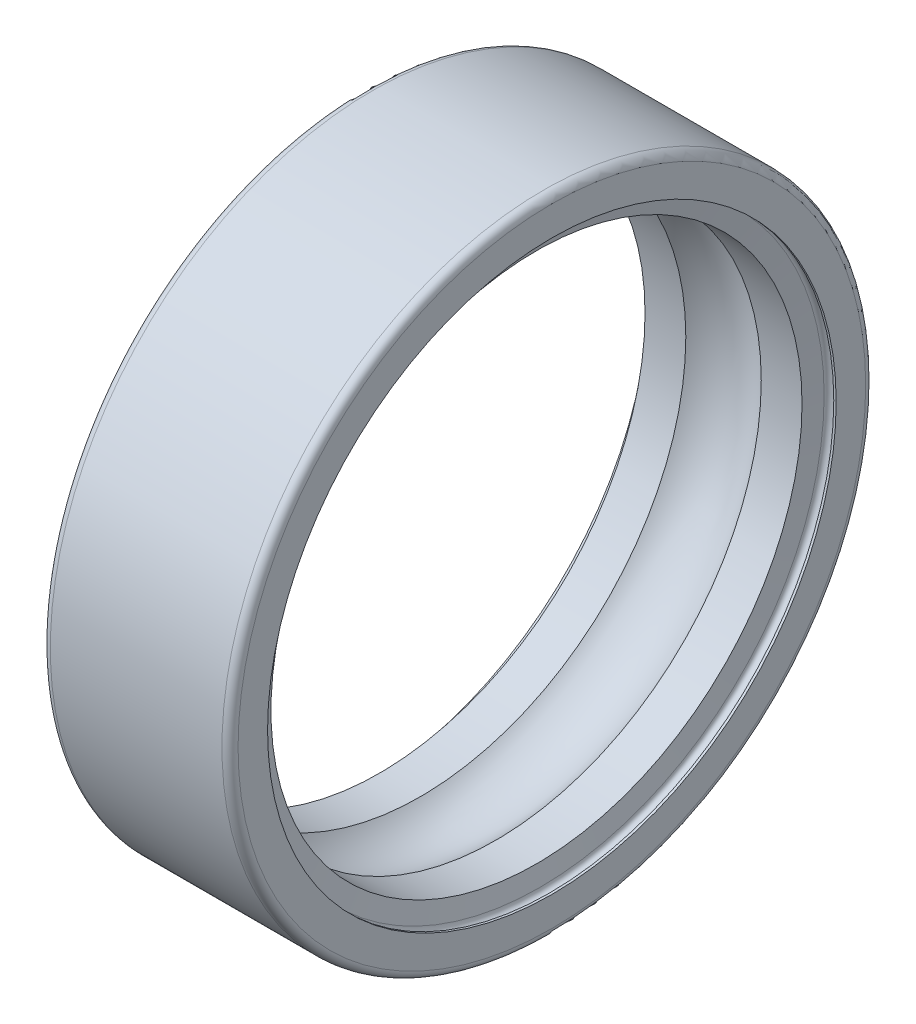
ISO-10303-21;
HEADER;
FILE_DESCRIPTION(('STEP AP214'),'2;1');
FILE_NAME('part.step','',(''),(''),'','','');
FILE_SCHEMA(('AUTOMOTIVE_DESIGN { 1 0 10303 214 1 1 1 1 }'));
ENDSEC;
DATA;
#1=APPLICATION_CONTEXT('core data for automotive mechanical design processes');
#2=APPLICATION_PROTOCOL_DEFINITION('international standard','automotive_design',2000,#1);
#3=PRODUCT_CONTEXT('',#1,'mechanical');
#4=PRODUCT('Part','Part','',(#3));
#5=PRODUCT_RELATED_PRODUCT_CATEGORY('part','',(#4));
#6=PRODUCT_DEFINITION_FORMATION('','',#4);
#7=PRODUCT_DEFINITION_CONTEXT('part definition',#1,'design');
#8=PRODUCT_DEFINITION('design','',#6,#7);
#9=PRODUCT_DEFINITION_SHAPE('','',#8);
#10=(LENGTH_UNIT() NAMED_UNIT(*) SI_UNIT(.MILLI.,.METRE.));
#11=(NAMED_UNIT(*) PLANE_ANGLE_UNIT() SI_UNIT($,.RADIAN.));
#12=(NAMED_UNIT(*) SI_UNIT($,.STERADIAN.) SOLID_ANGLE_UNIT());
#13=UNCERTAINTY_MEASURE_WITH_UNIT(LENGTH_MEASURE(1.E-05),#10,'distance_accuracy_value','');
#14=(GEOMETRIC_REPRESENTATION_CONTEXT(3) GLOBAL_UNCERTAINTY_ASSIGNED_CONTEXT((#13)) GLOBAL_UNIT_ASSIGNED_CONTEXT((#10,
#11,#12)) REPRESENTATION_CONTEXT('',''));
#15=CARTESIAN_POINT('',(0.,0.,0.));
#16=DIRECTION('',(0.,0.,1.));
#17=DIRECTION('',(1.,0.,0.));
#18=AXIS2_PLACEMENT_3D('',#15,#16,#17);
#19=CARTESIAN_POINT('',(0.,11.7,0.));
#20=DIRECTION('',(-1.,0.,0.));
#21=DIRECTION('',(0.,0.,1.));
#22=AXIS2_PLACEMENT_3D('',#19,#20,#21);
#23=PLANE('',#22);
#24=CARTESIAN_POINT('',(0.,0.,0.));
#25=DIRECTION('',(1.,0.,0.));
#26=DIRECTION('',(0.,0.,-1.));
#27=AXIS2_PLACEMENT_3D('',#24,#25,#26);
#28=CIRCLE('',#27,11.7);
#29=CARTESIAN_POINT('',(0.,0.,-11.7));
#30=VERTEX_POINT('',#29);
#31=EDGE_CURVE('E20',#30,#30,#28,.T.);
#32=ORIENTED_EDGE('',*,*,#31,.F.);
#33=EDGE_LOOP('',(#32));
#34=FACE_BOUND('',#33,.T.);
#35=CARTESIAN_POINT('',(0.,0.,0.));
#36=DIRECTION('',(1.,0.,0.));
#37=DIRECTION('',(0.,0.,-1.));
#38=AXIS2_PLACEMENT_3D('',#35,#36,#37);
#39=CIRCLE('',#38,10.6);
#40=CARTESIAN_POINT('',(0.,0.,-10.6));
#41=VERTEX_POINT('',#40);
#42=EDGE_CURVE('E11',#41,#41,#39,.T.);
#43=ORIENTED_EDGE('',*,*,#42,.T.);
#44=EDGE_LOOP('',(#43));
#45=FACE_BOUND('',#44,.T.);
#46=ADVANCED_FACE('F16',(#34,#45),#23,.T.);
#47=CARTESIAN_POINT('',(50.,0.,0.));
#48=DIRECTION('',(-1.,0.,0.));
#49=DIRECTION('',(0.,0.,-1.));
#50=AXIS2_PLACEMENT_3D('',#47,#48,#49);
#51=CYLINDRICAL_SURFACE('',#50,10.6);
#52=ORIENTED_EDGE('',*,*,#42,.F.);
#53=EDGE_LOOP('',(#52));
#54=FACE_BOUND('',#53,.T.);
#55=CARTESIAN_POINT('',(0.09,0.,0.));
#56=DIRECTION('',(1.,0.,0.));
#57=DIRECTION('',(0.,0.,-1.));
#58=AXIS2_PLACEMENT_3D('',#55,#56,#57);
#59=CIRCLE('',#58,10.6);
#60=CARTESIAN_POINT('',(0.09,0.,-10.6));
#61=VERTEX_POINT('',#60);
#62=EDGE_CURVE('E27',#61,#61,#59,.T.);
#63=ORIENTED_EDGE('',*,*,#62,.T.);
#64=EDGE_LOOP('',(#63));
#65=FACE_BOUND('',#64,.T.);
#66=ADVANCED_FACE('F163',(#54,#65),#51,.F.);
#67=CARTESIAN_POINT('',(0.27,0.,0.));
#68=DIRECTION('',(1.,0.,0.));
#69=DIRECTION('',(0.,0.,-1.));
#70=AXIS2_PLACEMENT_3D('',#67,#68,#69);
#71=TOROIDAL_SURFACE('',#70,10.6,0.18);
#72=CARTESIAN_POINT('',(0.45,0.,0.));
#73=DIRECTION('',(1.,0.,0.));
#74=DIRECTION('',(0.,0.,-1.));
#75=AXIS2_PLACEMENT_3D('',#72,#73,#74);
#76=CIRCLE('',#75,10.6);
#77=CARTESIAN_POINT('',(0.45,0.,-10.6));
#78=VERTEX_POINT('',#77);
#79=EDGE_CURVE('E104',#78,#78,#76,.T.);
#80=ORIENTED_EDGE('',*,*,#79,.T.);
#81=EDGE_LOOP('',(#80));
#82=FACE_BOUND('',#81,.T.);
#83=ORIENTED_EDGE('',*,*,#62,.F.);
#84=EDGE_LOOP('',(#83));
#85=FACE_BOUND('',#84,.T.);
#86=ADVANCED_FACE('F101',(#82,#85),#71,.F.);
#87=CARTESIAN_POINT('',(0.45,0.,0.));
#88=DIRECTION('',(-1.,0.,0.));
#89=DIRECTION('',(0.,0.,1.));
#90=AXIS2_PLACEMENT_3D('',#87,#88,#89);
#91=CONICAL_SURFACE('',#90,10.6,1.39626340159546);
#92=ORIENTED_EDGE('',*,*,#79,.F.);
#93=EDGE_LOOP('',(#92));
#94=FACE_BOUND('',#93,.T.);
#95=CARTESIAN_POINT('',(0.573428886495926,0.,0.));
#96=DIRECTION('',(1.,0.,0.));
#97=DIRECTION('',(0.,0.,-1.));
#98=AXIS2_PLACEMENT_3D('',#95,#96,#97);
#99=CIRCLE('',#98,9.9);
#100=CARTESIAN_POINT('',(0.573428886495926,0.,-9.9));
#101=VERTEX_POINT('',#100);
#102=EDGE_CURVE('E110',#101,#101,#99,.T.);
#103=ORIENTED_EDGE('',*,*,#102,.T.);
#104=EDGE_LOOP('',(#103));
#105=FACE_BOUND('',#104,.T.);
#106=ADVANCED_FACE('F198',(#94,#105),#91,.F.);
#107=CARTESIAN_POINT('',(50.,0.,0.));
#108=DIRECTION('',(-1.,0.,0.));
#109=DIRECTION('',(0.,0.,-1.));
#110=AXIS2_PLACEMENT_3D('',#107,#108,#109);
#111=CYLINDRICAL_SURFACE('',#110,9.9);
#112=ORIENTED_EDGE('',*,*,#102,.F.);
#113=EDGE_LOOP('',(#112));
#114=FACE_BOUND('',#113,.T.);
#115=CARTESIAN_POINT('',(2.09350071098489,0.,0.));
#116=DIRECTION('',(1.,0.,0.));
#117=DIRECTION('',(0.,0.,-1.));
#118=AXIS2_PLACEMENT_3D('',#115,#116,#117);
#119=CIRCLE('',#118,9.9);
#120=CARTESIAN_POINT('',(2.09350071098489,0.,-9.9));
#121=VERTEX_POINT('',#120);
#122=EDGE_CURVE('E128',#121,#121,#119,.T.);
#123=ORIENTED_EDGE('',*,*,#122,.T.);
#124=EDGE_LOOP('',(#123));
#125=FACE_BOUND('',#124,.T.);
#126=ADVANCED_FACE('F192',(#114,#125),#111,.F.);
#127=CARTESIAN_POINT('',(3.5,0.,0.));
#128=DIRECTION('',(1.,0.,0.));
#129=DIRECTION('',(0.,0.,-1.));
#130=AXIS2_PLACEMENT_3D('',#127,#128,#129);
#131=TOROIDAL_SURFACE('',#130,8.5,1.9845);
#132=CARTESIAN_POINT('',(4.90649928901511,0.,0.));
#133=DIRECTION('',(1.,0.,0.));
#134=DIRECTION('',(0.,0.,-1.));
#135=AXIS2_PLACEMENT_3D('',#132,#133,#134);
#136=CIRCLE('',#135,9.9);
#137=CARTESIAN_POINT('',(4.90649928901511,0.,-9.9));
#138=VERTEX_POINT('',#137);
#139=EDGE_CURVE('E90',#138,#138,#136,.T.);
#140=ORIENTED_EDGE('',*,*,#139,.T.);
#141=EDGE_LOOP('',(#140));
#142=FACE_BOUND('',#141,.T.);
#143=ORIENTED_EDGE('',*,*,#122,.F.);
#144=EDGE_LOOP('',(#143));
#145=FACE_BOUND('',#144,.T.);
#146=ADVANCED_FACE('F189',(#142,#145),#131,.F.);
#147=CARTESIAN_POINT('',(50.,0.,0.));
#148=DIRECTION('',(-1.,0.,0.));
#149=DIRECTION('',(0.,0.,-1.));
#150=AXIS2_PLACEMENT_3D('',#147,#148,#149);
#151=CYLINDRICAL_SURFACE('',#150,9.9);
#152=ORIENTED_EDGE('',*,*,#139,.F.);
#153=EDGE_LOOP('',(#152));
#154=FACE_BOUND('',#153,.T.);
#155=CARTESIAN_POINT('',(6.42657111350407,0.,0.));
#156=DIRECTION('',(1.,0.,0.));
#157=DIRECTION('',(0.,0.,-1.));
#158=AXIS2_PLACEMENT_3D('',#155,#156,#157);
#159=CIRCLE('',#158,9.9);
#160=CARTESIAN_POINT('',(6.42657111350407,0.,-9.9));
#161=VERTEX_POINT('',#160);
#162=EDGE_CURVE('E81',#161,#161,#159,.T.);
#163=ORIENTED_EDGE('',*,*,#162,.T.);
#164=EDGE_LOOP('',(#163));
#165=FACE_BOUND('',#164,.T.);
#166=ADVANCED_FACE('F177',(#154,#165),#151,.F.);
#167=CARTESIAN_POINT('',(6.42657111350407,0.,0.));
#168=DIRECTION('',(1.,0.,0.));
#169=DIRECTION('',(0.,0.,-1.));
#170=AXIS2_PLACEMENT_3D('',#167,#168,#169);
#171=CONICAL_SURFACE('',#170,9.9,1.39626340159546);
#172=CARTESIAN_POINT('',(6.55,0.,0.));
#173=DIRECTION('',(1.,0.,0.));
#174=DIRECTION('',(0.,0.,-1.));
#175=AXIS2_PLACEMENT_3D('',#172,#173,#174);
#176=CIRCLE('',#175,10.6);
#177=CARTESIAN_POINT('',(6.55,0.,-10.6));
#178=VERTEX_POINT('',#177);
#179=EDGE_CURVE('E74',#178,#178,#176,.T.);
#180=ORIENTED_EDGE('',*,*,#179,.T.);
#181=EDGE_LOOP('',(#180));
#182=FACE_BOUND('',#181,.T.);
#183=ORIENTED_EDGE('',*,*,#162,.F.);
#184=EDGE_LOOP('',(#183));
#185=FACE_BOUND('',#184,.T.);
#186=ADVANCED_FACE('F173',(#182,#185),#171,.F.);
#187=CARTESIAN_POINT('',(6.73,0.,0.));
#188=DIRECTION('',(1.,0.,0.));
#189=DIRECTION('',(0.,0.,-1.));
#190=AXIS2_PLACEMENT_3D('',#187,#188,#189);
#191=TOROIDAL_SURFACE('',#190,10.6000000094977,0.18);
#192=CARTESIAN_POINT('',(6.90999999999974,0.,0.));
#193=DIRECTION('',(1.,0.,0.));
#194=DIRECTION('',(0.,0.,-1.));
#195=AXIS2_PLACEMENT_3D('',#192,#193,#194);
#196=CIRCLE('',#195,10.600000313621);
#197=CARTESIAN_POINT('',(6.90999999999974,0.,-10.600000313621));
#198=VERTEX_POINT('',#197);
#199=EDGE_CURVE('E118',#198,#198,#196,.T.);
#200=ORIENTED_EDGE('',*,*,#199,.T.);
#201=EDGE_LOOP('',(#200));
#202=FACE_BOUND('',#201,.T.);
#203=ORIENTED_EDGE('',*,*,#179,.F.);
#204=EDGE_LOOP('',(#203));
#205=FACE_BOUND('',#204,.T.);
#206=ADVANCED_FACE('F176',(#202,#205),#191,.F.);
#207=CARTESIAN_POINT('',(50.,0.,0.));
#208=DIRECTION('',(-1.,0.,0.));
#209=DIRECTION('',(0.,0.,-1.));
#210=AXIS2_PLACEMENT_3D('',#207,#208,#209);
#211=CYLINDRICAL_SURFACE('',#210,10.6000001568105);
#212=ORIENTED_EDGE('',*,*,#199,.F.);
#213=EDGE_LOOP('',(#212));
#214=FACE_BOUND('',#213,.T.);
#215=CARTESIAN_POINT('',(7.,0.,0.));
#216=DIRECTION('',(1.,0.,0.));
#217=DIRECTION('',(0.,0.,-1.));
#218=AXIS2_PLACEMENT_3D('',#215,#216,#217);
#219=CIRCLE('',#218,10.6);
#220=CARTESIAN_POINT('',(7.,0.,-10.6));
#221=VERTEX_POINT('',#220);
#222=EDGE_CURVE('E113',#221,#221,#219,.T.);
#223=ORIENTED_EDGE('',*,*,#222,.T.);
#224=EDGE_LOOP('',(#223));
#225=FACE_BOUND('',#224,.T.);
#226=ADVANCED_FACE('F181',(#214,#225),#211,.F.);
#227=CARTESIAN_POINT('',(7.,10.6,0.));
#228=DIRECTION('',(1.,0.,0.));
#229=DIRECTION('',(0.,1.,0.));
#230=AXIS2_PLACEMENT_3D('',#227,#228,#229);
#231=PLANE('',#230);
#232=CARTESIAN_POINT('',(7.,0.,0.));
#233=DIRECTION('',(1.,0.,0.));
#234=DIRECTION('',(0.,0.,-1.));
#235=AXIS2_PLACEMENT_3D('',#232,#233,#234);
#236=CIRCLE('',#235,11.7);
#237=CARTESIAN_POINT('',(7.,0.,-11.7));
#238=VERTEX_POINT('',#237);
#239=EDGE_CURVE('E123',#238,#238,#236,.T.);
#240=ORIENTED_EDGE('',*,*,#239,.T.);
#241=EDGE_LOOP('',(#240));
#242=FACE_BOUND('',#241,.T.);
#243=ORIENTED_EDGE('',*,*,#222,.F.);
#244=EDGE_LOOP('',(#243));
#245=FACE_BOUND('',#244,.T.);
#246=ADVANCED_FACE('F183',(#242,#245),#231,.T.);
#247=CARTESIAN_POINT('',(6.7,0.,0.));
#248=DIRECTION('',(1.,0.,0.));
#249=DIRECTION('',(0.,0.,-1.));
#250=AXIS2_PLACEMENT_3D('',#247,#248,#249);
#251=TOROIDAL_SURFACE('',#250,11.7,0.3);
#252=ORIENTED_EDGE('',*,*,#239,.F.);
#253=EDGE_LOOP('',(#252));
#254=FACE_BOUND('',#253,.T.);
#255=CARTESIAN_POINT('',(6.7,0.,0.));
#256=DIRECTION('',(1.,0.,0.));
#257=DIRECTION('',(0.,0.,-1.));
#258=AXIS2_PLACEMENT_3D('',#255,#256,#257);
#259=CIRCLE('',#258,12.);
#260=CARTESIAN_POINT('',(6.7,0.,-12.));
#261=VERTEX_POINT('',#260);
#262=EDGE_CURVE('E119',#261,#261,#259,.T.);
#263=ORIENTED_EDGE('',*,*,#262,.T.);
#264=EDGE_LOOP('',(#263));
#265=FACE_BOUND('',#264,.T.);
#266=ADVANCED_FACE('F159',(#254,#265),#251,.T.);
#267=CARTESIAN_POINT('',(50.,0.,0.));
#268=DIRECTION('',(-1.,0.,0.));
#269=DIRECTION('',(0.,0.,-1.));
#270=AXIS2_PLACEMENT_3D('',#267,#268,#269);
#271=CYLINDRICAL_SURFACE('',#270,12.);
#272=ORIENTED_EDGE('',*,*,#262,.F.);
#273=EDGE_LOOP('',(#272));
#274=FACE_BOUND('',#273,.T.);
#275=CARTESIAN_POINT('',(0.3,0.,0.));
#276=DIRECTION('',(1.,0.,0.));
#277=DIRECTION('',(0.,0.,-1.));
#278=AXIS2_PLACEMENT_3D('',#275,#276,#277);
#279=CIRCLE('',#278,12.);
#280=CARTESIAN_POINT('',(0.3,0.,-12.));
#281=VERTEX_POINT('',#280);
#282=EDGE_CURVE('E124',#281,#281,#279,.T.);
#283=ORIENTED_EDGE('',*,*,#282,.T.);
#284=EDGE_LOOP('',(#283));
#285=FACE_BOUND('',#284,.T.);
#286=ADVANCED_FACE('F153',(#274,#285),#271,.T.);
#287=CARTESIAN_POINT('',(0.3,0.,0.));
#288=DIRECTION('',(1.,0.,0.));
#289=DIRECTION('',(0.,0.,-1.));
#290=AXIS2_PLACEMENT_3D('',#287,#288,#289);
#291=TOROIDAL_SURFACE('',#290,11.7,0.3);
#292=ORIENTED_EDGE('',*,*,#282,.F.);
#293=EDGE_LOOP('',(#292));
#294=FACE_BOUND('',#293,.T.);
#295=ORIENTED_EDGE('',*,*,#31,.T.);
#296=EDGE_LOOP('',(#295));
#297=FACE_BOUND('',#296,.T.);
#298=ADVANCED_FACE('F18',(#294,#297),#291,.T.);
#299=CLOSED_SHELL('',(#46,#66,#86,#106,#126,#146,#166,#186,#206,#226,#246,#266,#286,#298));
#300=MANIFOLD_SOLID_BREP('B1',#299);
#301=ADVANCED_BREP_SHAPE_REPRESENTATION('',(#18,#300),#14);
#302=SHAPE_DEFINITION_REPRESENTATION(#9,#301);
ENDSEC;
END-ISO-10303-21;
